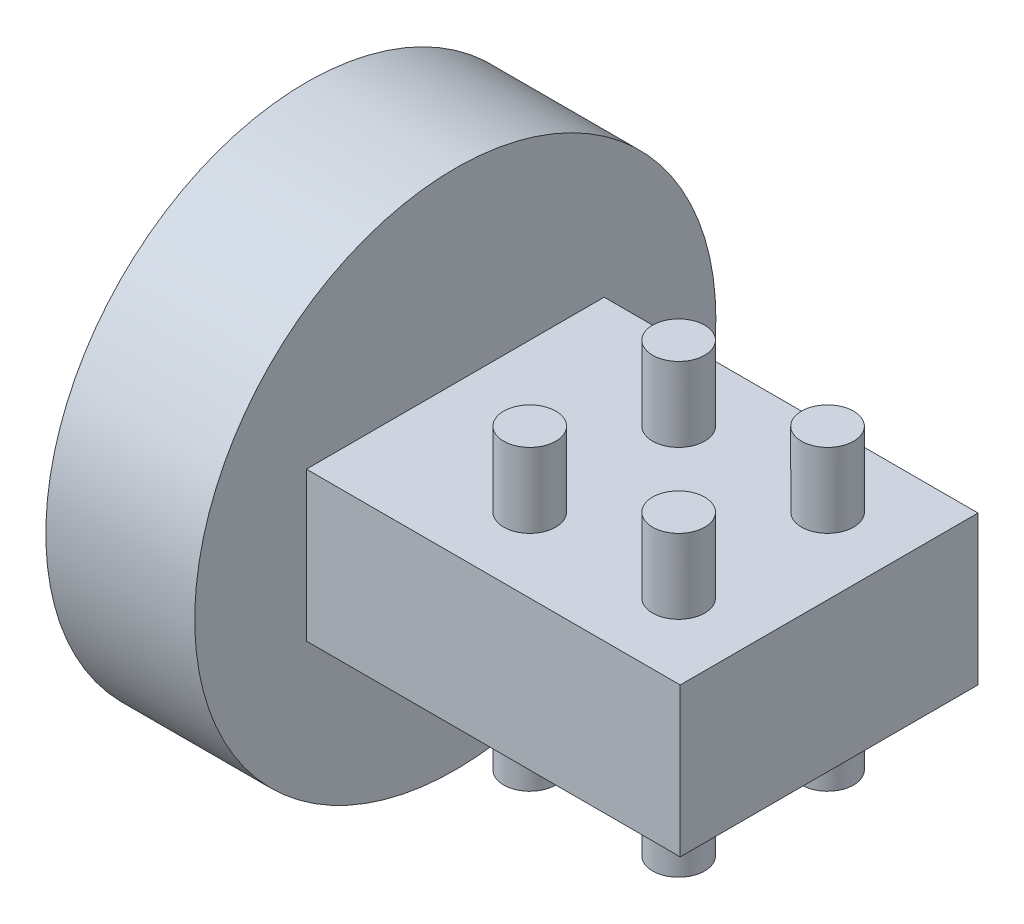
ISO-10303-21;
HEADER;
FILE_DESCRIPTION(('STEP AP214'),'2;1');
FILE_NAME('part.step','',(''),(''),'','','');
FILE_SCHEMA(('AUTOMOTIVE_DESIGN { 1 0 10303 214 1 1 1 1 }'));
ENDSEC;
DATA;
#1=APPLICATION_CONTEXT('core data for automotive mechanical design processes');
#2=APPLICATION_PROTOCOL_DEFINITION('international standard','automotive_design',2000,#1);
#3=PRODUCT_CONTEXT('',#1,'mechanical');
#4=PRODUCT('Part','Part','',(#3));
#5=PRODUCT_RELATED_PRODUCT_CATEGORY('part','',(#4));
#6=PRODUCT_DEFINITION_FORMATION('','',#4);
#7=PRODUCT_DEFINITION_CONTEXT('part definition',#1,'design');
#8=PRODUCT_DEFINITION('design','',#6,#7);
#9=PRODUCT_DEFINITION_SHAPE('','',#8);
#10=(LENGTH_UNIT() NAMED_UNIT(*) SI_UNIT(.MILLI.,.METRE.));
#11=(NAMED_UNIT(*) PLANE_ANGLE_UNIT() SI_UNIT($,.RADIAN.));
#12=(NAMED_UNIT(*) SI_UNIT($,.STERADIAN.) SOLID_ANGLE_UNIT());
#13=UNCERTAINTY_MEASURE_WITH_UNIT(LENGTH_MEASURE(1.E-05),#10,'distance_accuracy_value','');
#14=(GEOMETRIC_REPRESENTATION_CONTEXT(3) GLOBAL_UNCERTAINTY_ASSIGNED_CONTEXT((#13)) GLOBAL_UNIT_ASSIGNED_CONTEXT((#10,
#11,#12)) REPRESENTATION_CONTEXT('',''));
#15=CARTESIAN_POINT('',(0.,0.,0.));
#16=DIRECTION('',(0.,0.,1.));
#17=DIRECTION('',(1.,0.,0.));
#18=AXIS2_PLACEMENT_3D('',#15,#16,#17);
#19=CARTESIAN_POINT('',(20.,0.,0.));
#20=DIRECTION('',(-1.,0.,0.));
#21=DIRECTION('',(0.,0.,1.));
#22=AXIS2_PLACEMENT_3D('',#19,#20,#21);
#23=CYLINDRICAL_SURFACE('',#22,35.);
#24=CARTESIAN_POINT('',(20.,0.,0.));
#25=DIRECTION('',(1.,0.,0.));
#26=DIRECTION('',(0.,0.,-1.));
#27=AXIS2_PLACEMENT_3D('',#24,#25,#26);
#28=CIRCLE('',#27,35.);
#29=CARTESIAN_POINT('',(20.,0.,-35.));
#30=VERTEX_POINT('',#29);
#31=EDGE_CURVE('E124',#30,#30,#28,.T.);
#32=ORIENTED_EDGE('',*,*,#31,.F.);
#33=EDGE_LOOP('',(#32));
#34=FACE_BOUND('',#33,.T.);
#35=CARTESIAN_POINT('',(0.,0.,0.));
#36=DIRECTION('',(1.,0.,0.));
#37=DIRECTION('',(0.,0.,-1.));
#38=AXIS2_PLACEMENT_3D('',#35,#36,#37);
#39=CIRCLE('',#38,35.);
#40=CARTESIAN_POINT('',(0.,0.,-35.));
#41=VERTEX_POINT('',#40);
#42=EDGE_CURVE('E121',#41,#41,#39,.T.);
#43=ORIENTED_EDGE('',*,*,#42,.T.);
#44=EDGE_LOOP('',(#43));
#45=FACE_BOUND('',#44,.T.);
#46=ADVANCED_FACE('F32',(#34,#45),#23,.T.);
#47=CARTESIAN_POINT('',(20.,0.,0.));
#48=DIRECTION('',(1.,0.,0.));
#49=DIRECTION('',(0.,0.,-1.));
#50=AXIS2_PLACEMENT_3D('',#47,#48,#49);
#51=PLANE('',#50);
#52=DIRECTION('',(0.,0.,-1.));
#53=VECTOR('',#52,1.);
#54=CARTESIAN_POINT('',(20.,-10.,0.));
#55=LINE('',#54,#53);
#56=CARTESIAN_POINT('',(20.,-10.,20.));
#57=VERTEX_POINT('',#56);
#58=CARTESIAN_POINT('',(20.,-10.,-20.));
#59=VERTEX_POINT('',#58);
#60=EDGE_CURVE('E56',#57,#59,#55,.T.);
#61=ORIENTED_EDGE('',*,*,#60,.F.);
#62=DIRECTION('',(0.,-1.,0.));
#63=VECTOR('',#62,1.);
#64=CARTESIAN_POINT('',(20.,0.,20.));
#65=LINE('',#64,#63);
#66=CARTESIAN_POINT('',(20.,10.,20.));
#67=VERTEX_POINT('',#66);
#68=EDGE_CURVE('E115',#67,#57,#65,.T.);
#69=ORIENTED_EDGE('',*,*,#68,.F.);
#70=DIRECTION('',(0.,0.,-1.));
#71=VECTOR('',#70,1.);
#72=CARTESIAN_POINT('',(20.,10.,0.));
#73=LINE('',#72,#71);
#74=CARTESIAN_POINT('',(20.,10.,-20.));
#75=VERTEX_POINT('',#74);
#76=EDGE_CURVE('E110',#67,#75,#73,.T.);
#77=ORIENTED_EDGE('',*,*,#76,.T.);
#78=DIRECTION('',(0.,1.,0.));
#79=VECTOR('',#78,1.);
#80=CARTESIAN_POINT('',(20.,0.,-20.));
#81=LINE('',#80,#79);
#82=EDGE_CURVE('E89',#59,#75,#81,.T.);
#83=ORIENTED_EDGE('',*,*,#82,.F.);
#84=EDGE_LOOP('',(#61,#69,#77,#83));
#85=FACE_BOUND('',#84,.T.);
#86=ORIENTED_EDGE('',*,*,#31,.T.);
#87=EDGE_LOOP('',(#86));
#88=FACE_BOUND('',#87,.T.);
#89=ADVANCED_FACE('F178',(#85,#88),#51,.T.);
#90=CARTESIAN_POINT('',(0.,0.,0.));
#91=DIRECTION('',(1.,0.,0.));
#92=DIRECTION('',(0.,0.,-1.));
#93=AXIS2_PLACEMENT_3D('',#90,#91,#92);
#94=PLANE('',#93);
#95=CARTESIAN_POINT('',(0.,0.,0.));
#96=DIRECTION('',(1.,0.,0.));
#97=DIRECTION('',(0.,0.,-1.));
#98=AXIS2_PLACEMENT_3D('',#95,#96,#97);
#99=CIRCLE('',#98,25.);
#100=CARTESIAN_POINT('',(0.,0.,-25.));
#101=VERTEX_POINT('',#100);
#102=EDGE_CURVE('E117',#101,#101,#99,.T.);
#103=ORIENTED_EDGE('',*,*,#102,.T.);
#104=EDGE_LOOP('',(#103));
#105=FACE_BOUND('',#104,.T.);
#106=ORIENTED_EDGE('',*,*,#42,.F.);
#107=EDGE_LOOP('',(#106));
#108=FACE_BOUND('',#107,.T.);
#109=ADVANCED_FACE('F183',(#105,#108),#94,.F.);
#110=CARTESIAN_POINT('',(10.,0.,0.));
#111=DIRECTION('',(-1.,0.,0.));
#112=DIRECTION('',(0.,0.,1.));
#113=AXIS2_PLACEMENT_3D('',#110,#111,#112);
#114=CYLINDRICAL_SURFACE('',#113,25.);
#115=CARTESIAN_POINT('',(10.,0.,0.));
#116=DIRECTION('',(1.,0.,0.));
#117=DIRECTION('',(0.,0.,-1.));
#118=AXIS2_PLACEMENT_3D('',#115,#116,#117);
#119=CIRCLE('',#118,25.);
#120=CARTESIAN_POINT('',(10.,0.,-25.));
#121=VERTEX_POINT('',#120);
#122=EDGE_CURVE('E118',#121,#121,#119,.T.);
#123=ORIENTED_EDGE('',*,*,#122,.T.);
#124=EDGE_LOOP('',(#123));
#125=FACE_BOUND('',#124,.T.);
#126=ORIENTED_EDGE('',*,*,#102,.F.);
#127=EDGE_LOOP('',(#126));
#128=FACE_BOUND('',#127,.T.);
#129=ADVANCED_FACE('F191',(#125,#128),#114,.F.);
#130=CARTESIAN_POINT('',(10.,0.,0.));
#131=DIRECTION('',(1.,0.,0.));
#132=DIRECTION('',(0.,0.,-1.));
#133=AXIS2_PLACEMENT_3D('',#130,#131,#132);
#134=PLANE('',#133);
#135=ORIENTED_EDGE('',*,*,#122,.F.);
#136=EDGE_LOOP('',(#135));
#137=FACE_BOUND('',#136,.T.);
#138=ADVANCED_FACE('F196',(#137),#134,.F.);
#139=CARTESIAN_POINT('',(70.2084526816561,-10.,20.));
#140=DIRECTION('',(1.,0.,0.));
#141=DIRECTION('',(0.,0.,-1.));
#142=AXIS2_PLACEMENT_3D('',#139,#140,#141);
#143=PLANE('',#142);
#144=DIRECTION('',(0.,1.,0.));
#145=VECTOR('',#144,1.);
#146=CARTESIAN_POINT('',(70.2084526816561,-10.,-20.));
#147=LINE('',#146,#145);
#148=CARTESIAN_POINT('',(70.2084526816561,-10.,-20.));
#149=VERTEX_POINT('',#148);
#150=CARTESIAN_POINT('',(70.2084526816561,10.,-20.));
#151=VERTEX_POINT('',#150);
#152=EDGE_CURVE('E77',#149,#151,#147,.T.);
#153=ORIENTED_EDGE('',*,*,#152,.T.);
#154=DIRECTION('',(0.,0.,-1.));
#155=VECTOR('',#154,1.);
#156=CARTESIAN_POINT('',(70.2084526816561,10.,20.));
#157=LINE('',#156,#155);
#158=CARTESIAN_POINT('',(70.2084526816561,10.,20.));
#159=VERTEX_POINT('',#158);
#160=EDGE_CURVE('E80',#159,#151,#157,.T.);
#161=ORIENTED_EDGE('',*,*,#160,.F.);
#162=DIRECTION('',(0.,1.,0.));
#163=VECTOR('',#162,1.);
#164=CARTESIAN_POINT('',(70.2084526816561,-10.,20.));
#165=LINE('',#164,#163);
#166=CARTESIAN_POINT('',(70.2084526816561,-10.,20.));
#167=VERTEX_POINT('',#166);
#168=EDGE_CURVE('E84',#167,#159,#165,.T.);
#169=ORIENTED_EDGE('',*,*,#168,.F.);
#170=DIRECTION('',(0.,0.,-1.));
#171=VECTOR('',#170,1.);
#172=CARTESIAN_POINT('',(70.2084526816561,-10.,20.));
#173=LINE('',#172,#171);
#174=EDGE_CURVE('E82',#167,#149,#173,.T.);
#175=ORIENTED_EDGE('',*,*,#174,.T.);
#176=EDGE_LOOP('',(#153,#161,#169,#175));
#177=FACE_BOUND('',#176,.T.);
#178=ADVANCED_FACE('F78',(#177),#143,.T.);
#179=CARTESIAN_POINT('',(0.208452681656133,-10.,20.));
#180=DIRECTION('',(0.,0.,1.));
#181=DIRECTION('',(1.,0.,0.));
#182=AXIS2_PLACEMENT_3D('',#179,#180,#181);
#183=PLANE('',#182);
#184=DIRECTION('',(1.,0.,0.));
#185=VECTOR('',#184,1.);
#186=CARTESIAN_POINT('',(0.208452681656133,10.,20.));
#187=LINE('',#186,#185);
#188=EDGE_CURVE('E91',#67,#159,#187,.T.);
#189=ORIENTED_EDGE('',*,*,#188,.F.);
#190=ORIENTED_EDGE('',*,*,#68,.T.);
#191=DIRECTION('',(1.,0.,0.));
#192=VECTOR('',#191,1.);
#193=CARTESIAN_POINT('',(0.208452681656133,-10.,20.));
#194=LINE('',#193,#192);
#195=EDGE_CURVE('E85',#57,#167,#194,.T.);
#196=ORIENTED_EDGE('',*,*,#195,.T.);
#197=ORIENTED_EDGE('',*,*,#168,.T.);
#198=EDGE_LOOP('',(#189,#190,#196,#197));
#199=FACE_BOUND('',#198,.T.);
#200=ADVANCED_FACE('F205',(#199),#183,.T.);
#201=CARTESIAN_POINT('',(0.208452681656125,-10.,-20.));
#202=DIRECTION('',(0.,0.,-1.));
#203=DIRECTION('',(-1.,0.,0.));
#204=AXIS2_PLACEMENT_3D('',#201,#202,#203);
#205=PLANE('',#204);
#206=DIRECTION('',(-1.,0.,0.));
#207=VECTOR('',#206,1.);
#208=CARTESIAN_POINT('',(0.208452681656125,-10.,-20.));
#209=LINE('',#208,#207);
#210=EDGE_CURVE('E107',#149,#59,#209,.T.);
#211=ORIENTED_EDGE('',*,*,#210,.T.);
#212=ORIENTED_EDGE('',*,*,#82,.T.);
#213=DIRECTION('',(-1.,0.,0.));
#214=VECTOR('',#213,1.);
#215=CARTESIAN_POINT('',(0.208452681656125,10.,-20.));
#216=LINE('',#215,#214);
#217=EDGE_CURVE('E48',#151,#75,#216,.T.);
#218=ORIENTED_EDGE('',*,*,#217,.F.);
#219=ORIENTED_EDGE('',*,*,#152,.F.);
#220=EDGE_LOOP('',(#211,#212,#218,#219));
#221=FACE_BOUND('',#220,.T.);
#222=ADVANCED_FACE('F87',(#221),#205,.T.);
#223=CARTESIAN_POINT('',(0.,-10.,0.));
#224=DIRECTION('',(0.,-1.,0.));
#225=DIRECTION('',(0.,0.,-1.));
#226=AXIS2_PLACEMENT_3D('',#223,#224,#225);
#227=PLANE('',#226);
#228=CARTESIAN_POINT('',(60.,-10.,10.));
#229=DIRECTION('',(0.,-1.,0.));
#230=DIRECTION('',(0.,0.,-1.));
#231=AXIS2_PLACEMENT_3D('',#228,#229,#230);
#232=CIRCLE('',#231,3.50000000000001);
#233=CARTESIAN_POINT('',(60.,-10.,6.49999999999999));
#234=VERTEX_POINT('',#233);
#235=EDGE_CURVE('E11',#234,#234,#232,.T.);
#236=ORIENTED_EDGE('',*,*,#235,.F.);
#237=EDGE_LOOP('',(#236));
#238=FACE_BOUND('',#237,.T.);
#239=CARTESIAN_POINT('',(60.,-10.,-10.));
#240=DIRECTION('',(0.,-1.,0.));
#241=DIRECTION('',(0.,0.,-1.));
#242=AXIS2_PLACEMENT_3D('',#239,#240,#241);
#243=CIRCLE('',#242,3.50000000000001);
#244=CARTESIAN_POINT('',(60.,-10.,-13.5));
#245=VERTEX_POINT('',#244);
#246=EDGE_CURVE('E40',#245,#245,#243,.T.);
#247=ORIENTED_EDGE('',*,*,#246,.F.);
#248=EDGE_LOOP('',(#247));
#249=FACE_BOUND('',#248,.T.);
#250=CARTESIAN_POINT('',(40.,-10.,-10.));
#251=DIRECTION('',(0.,-1.,0.));
#252=DIRECTION('',(0.,0.,-1.));
#253=AXIS2_PLACEMENT_3D('',#250,#251,#252);
#254=CIRCLE('',#253,3.5);
#255=CARTESIAN_POINT('',(40.,-10.,-13.5));
#256=VERTEX_POINT('',#255);
#257=EDGE_CURVE('E150',#256,#256,#254,.T.);
#258=ORIENTED_EDGE('',*,*,#257,.F.);
#259=EDGE_LOOP('',(#258));
#260=FACE_BOUND('',#259,.T.);
#261=CARTESIAN_POINT('',(40.,-10.,10.));
#262=DIRECTION('',(0.,-1.,0.));
#263=DIRECTION('',(0.,0.,-1.));
#264=AXIS2_PLACEMENT_3D('',#261,#262,#263);
#265=CIRCLE('',#264,3.5);
#266=CARTESIAN_POINT('',(40.,-10.,6.5));
#267=VERTEX_POINT('',#266);
#268=EDGE_CURVE('E102',#267,#267,#265,.T.);
#269=ORIENTED_EDGE('',*,*,#268,.F.);
#270=EDGE_LOOP('',(#269));
#271=FACE_BOUND('',#270,.T.);
#272=ORIENTED_EDGE('',*,*,#195,.F.);
#273=ORIENTED_EDGE('',*,*,#60,.T.);
#274=ORIENTED_EDGE('',*,*,#210,.F.);
#275=ORIENTED_EDGE('',*,*,#174,.F.);
#276=EDGE_LOOP('',(#272,#273,#274,#275));
#277=FACE_BOUND('',#276,.T.);
#278=ADVANCED_FACE('F208',(#238,#249,#260,#271,#277),#227,.T.);
#279=CARTESIAN_POINT('',(0.,10.,0.));
#280=DIRECTION('',(0.,-1.,0.));
#281=DIRECTION('',(0.,0.,-1.));
#282=AXIS2_PLACEMENT_3D('',#279,#280,#281);
#283=PLANE('',#282);
#284=CARTESIAN_POINT('',(60.,10.,10.));
#285=DIRECTION('',(0.,-1.,0.));
#286=DIRECTION('',(0.,0.,-1.));
#287=AXIS2_PLACEMENT_3D('',#284,#285,#286);
#288=CIRCLE('',#287,3.50000000000001);
#289=CARTESIAN_POINT('',(60.,10.,6.49999999999999));
#290=VERTEX_POINT('',#289);
#291=EDGE_CURVE('E35',#290,#290,#288,.T.);
#292=ORIENTED_EDGE('',*,*,#291,.T.);
#293=EDGE_LOOP('',(#292));
#294=FACE_BOUND('',#293,.T.);
#295=CARTESIAN_POINT('',(60.,10.,-10.));
#296=DIRECTION('',(0.,-1.,0.));
#297=DIRECTION('',(0.,0.,-1.));
#298=AXIS2_PLACEMENT_3D('',#295,#296,#297);
#299=CIRCLE('',#298,3.50000000000001);
#300=CARTESIAN_POINT('',(60.,10.,-13.5));
#301=VERTEX_POINT('',#300);
#302=EDGE_CURVE('E133',#301,#301,#299,.T.);
#303=ORIENTED_EDGE('',*,*,#302,.T.);
#304=EDGE_LOOP('',(#303));
#305=FACE_BOUND('',#304,.T.);
#306=CARTESIAN_POINT('',(40.,10.,-10.));
#307=DIRECTION('',(0.,-1.,0.));
#308=DIRECTION('',(0.,0.,-1.));
#309=AXIS2_PLACEMENT_3D('',#306,#307,#308);
#310=CIRCLE('',#309,3.5);
#311=CARTESIAN_POINT('',(40.,10.,-13.5));
#312=VERTEX_POINT('',#311);
#313=EDGE_CURVE('E129',#312,#312,#310,.T.);
#314=ORIENTED_EDGE('',*,*,#313,.T.);
#315=EDGE_LOOP('',(#314));
#316=FACE_BOUND('',#315,.T.);
#317=CARTESIAN_POINT('',(40.,10.,10.));
#318=DIRECTION('',(0.,-1.,0.));
#319=DIRECTION('',(0.,0.,-1.));
#320=AXIS2_PLACEMENT_3D('',#317,#318,#319);
#321=CIRCLE('',#320,3.5);
#322=CARTESIAN_POINT('',(40.,10.,6.5));
#323=VERTEX_POINT('',#322);
#324=EDGE_CURVE('E96',#323,#323,#321,.T.);
#325=ORIENTED_EDGE('',*,*,#324,.T.);
#326=EDGE_LOOP('',(#325));
#327=FACE_BOUND('',#326,.T.);
#328=ORIENTED_EDGE('',*,*,#76,.F.);
#329=ORIENTED_EDGE('',*,*,#188,.T.);
#330=ORIENTED_EDGE('',*,*,#160,.T.);
#331=ORIENTED_EDGE('',*,*,#217,.T.);
#332=EDGE_LOOP('',(#328,#329,#330,#331));
#333=FACE_BOUND('',#332,.T.);
#334=ADVANCED_FACE('F93',(#294,#305,#316,#327,#333),#283,.F.);
#335=CARTESIAN_POINT('',(40.,20.,10.));
#336=DIRECTION('',(0.,1.,0.));
#337=DIRECTION('',(0.,0.,1.));
#338=AXIS2_PLACEMENT_3D('',#335,#336,#337);
#339=PLANE('',#338);
#340=CARTESIAN_POINT('',(40.,20.,10.));
#341=DIRECTION('',(0.,1.,0.));
#342=DIRECTION('',(0.,0.,1.));
#343=AXIS2_PLACEMENT_3D('',#340,#341,#342);
#344=CIRCLE('',#343,3.5);
#345=CARTESIAN_POINT('',(40.,20.,13.5));
#346=VERTEX_POINT('',#345);
#347=EDGE_CURVE('E131',#346,#346,#344,.T.);
#348=ORIENTED_EDGE('',*,*,#347,.T.);
#349=EDGE_LOOP('',(#348));
#350=FACE_BOUND('',#349,.T.);
#351=ADVANCED_FACE('F216',(#350),#339,.T.);
#352=CARTESIAN_POINT('',(40.,-20.,10.));
#353=DIRECTION('',(0.,1.,0.));
#354=DIRECTION('',(0.,0.,1.));
#355=AXIS2_PLACEMENT_3D('',#352,#353,#354);
#356=CYLINDRICAL_SURFACE('',#355,3.5);
#357=ORIENTED_EDGE('',*,*,#347,.F.);
#358=EDGE_LOOP('',(#357));
#359=FACE_BOUND('',#358,.T.);
#360=ORIENTED_EDGE('',*,*,#324,.F.);
#361=EDGE_LOOP('',(#360));
#362=FACE_BOUND('',#361,.T.);
#363=ADVANCED_FACE('F173',(#359,#362),#356,.T.);
#364=ORIENTED_EDGE('',*,*,#268,.T.);
#365=EDGE_LOOP('',(#364));
#366=FACE_BOUND('',#365,.T.);
#367=CARTESIAN_POINT('',(40.,-20.,10.));
#368=DIRECTION('',(0.,1.,0.));
#369=DIRECTION('',(0.,0.,1.));
#370=AXIS2_PLACEMENT_3D('',#367,#368,#369);
#371=CIRCLE('',#370,3.5);
#372=CARTESIAN_POINT('',(40.,-20.,13.5));
#373=VERTEX_POINT('',#372);
#374=EDGE_CURVE('E99',#373,#373,#371,.T.);
#375=ORIENTED_EDGE('',*,*,#374,.T.);
#376=EDGE_LOOP('',(#375));
#377=FACE_BOUND('',#376,.T.);
#378=ADVANCED_FACE('F160',(#366,#377),#356,.T.);
#379=CARTESIAN_POINT('',(40.,-20.,10.));
#380=DIRECTION('',(0.,1.,0.));
#381=DIRECTION('',(0.,0.,1.));
#382=AXIS2_PLACEMENT_3D('',#379,#380,#381);
#383=PLANE('',#382);
#384=ORIENTED_EDGE('',*,*,#374,.F.);
#385=EDGE_LOOP('',(#384));
#386=FACE_BOUND('',#385,.T.);
#387=ADVANCED_FACE('F162',(#386),#383,.F.);
#388=CARTESIAN_POINT('',(40.,20.,-10.));
#389=DIRECTION('',(0.,1.,0.));
#390=DIRECTION('',(0.,0.,1.));
#391=AXIS2_PLACEMENT_3D('',#388,#389,#390);
#392=PLANE('',#391);
#393=CARTESIAN_POINT('',(40.,20.,-10.));
#394=DIRECTION('',(0.,1.,0.));
#395=DIRECTION('',(0.,0.,1.));
#396=AXIS2_PLACEMENT_3D('',#393,#394,#395);
#397=CIRCLE('',#396,3.5);
#398=CARTESIAN_POINT('',(40.,20.,-6.5));
#399=VERTEX_POINT('',#398);
#400=EDGE_CURVE('E135',#399,#399,#397,.T.);
#401=ORIENTED_EDGE('',*,*,#400,.T.);
#402=EDGE_LOOP('',(#401));
#403=FACE_BOUND('',#402,.T.);
#404=ADVANCED_FACE('F164',(#403),#392,.T.);
#405=CARTESIAN_POINT('',(40.,-20.,-10.));
#406=DIRECTION('',(0.,1.,0.));
#407=DIRECTION('',(0.,0.,1.));
#408=AXIS2_PLACEMENT_3D('',#405,#406,#407);
#409=CYLINDRICAL_SURFACE('',#408,3.5);
#410=ORIENTED_EDGE('',*,*,#400,.F.);
#411=EDGE_LOOP('',(#410));
#412=FACE_BOUND('',#411,.T.);
#413=ORIENTED_EDGE('',*,*,#313,.F.);
#414=EDGE_LOOP('',(#413));
#415=FACE_BOUND('',#414,.T.);
#416=ADVANCED_FACE('F170',(#412,#415),#409,.T.);
#417=ORIENTED_EDGE('',*,*,#257,.T.);
#418=EDGE_LOOP('',(#417));
#419=FACE_BOUND('',#418,.T.);
#420=CARTESIAN_POINT('',(40.,-20.,-10.));
#421=DIRECTION('',(0.,1.,0.));
#422=DIRECTION('',(0.,0.,1.));
#423=AXIS2_PLACEMENT_3D('',#420,#421,#422);
#424=CIRCLE('',#423,3.5);
#425=CARTESIAN_POINT('',(40.,-20.,-6.5));
#426=VERTEX_POINT('',#425);
#427=EDGE_CURVE('E132',#426,#426,#424,.T.);
#428=ORIENTED_EDGE('',*,*,#427,.T.);
#429=EDGE_LOOP('',(#428));
#430=FACE_BOUND('',#429,.T.);
#431=ADVANCED_FACE('F259',(#419,#430),#409,.T.);
#432=CARTESIAN_POINT('',(40.,-20.,-10.));
#433=DIRECTION('',(0.,1.,0.));
#434=DIRECTION('',(0.,0.,1.));
#435=AXIS2_PLACEMENT_3D('',#432,#433,#434);
#436=PLANE('',#435);
#437=ORIENTED_EDGE('',*,*,#427,.F.);
#438=EDGE_LOOP('',(#437));
#439=FACE_BOUND('',#438,.T.);
#440=ADVANCED_FACE('F269',(#439),#436,.F.);
#441=CARTESIAN_POINT('',(60.,20.,-10.));
#442=DIRECTION('',(0.,1.,0.));
#443=DIRECTION('',(0.,0.,1.));
#444=AXIS2_PLACEMENT_3D('',#441,#442,#443);
#445=PLANE('',#444);
#446=CARTESIAN_POINT('',(60.,20.,-10.));
#447=DIRECTION('',(0.,1.,0.));
#448=DIRECTION('',(0.,0.,1.));
#449=AXIS2_PLACEMENT_3D('',#446,#447,#448);
#450=CIRCLE('',#449,3.50000000000001);
#451=CARTESIAN_POINT('',(60.,20.,-6.49999999999999));
#452=VERTEX_POINT('',#451);
#453=EDGE_CURVE('E142',#452,#452,#450,.T.);
#454=ORIENTED_EDGE('',*,*,#453,.T.);
#455=EDGE_LOOP('',(#454));
#456=FACE_BOUND('',#455,.T.);
#457=ADVANCED_FACE('F278',(#456),#445,.T.);
#458=CARTESIAN_POINT('',(60.,-20.,-10.));
#459=DIRECTION('',(0.,1.,0.));
#460=DIRECTION('',(0.,0.,1.));
#461=AXIS2_PLACEMENT_3D('',#458,#459,#460);
#462=CYLINDRICAL_SURFACE('',#461,3.50000000000001);
#463=ORIENTED_EDGE('',*,*,#453,.F.);
#464=EDGE_LOOP('',(#463));
#465=FACE_BOUND('',#464,.T.);
#466=ORIENTED_EDGE('',*,*,#302,.F.);
#467=EDGE_LOOP('',(#466));
#468=FACE_BOUND('',#467,.T.);
#469=ADVANCED_FACE('F288',(#465,#468),#462,.T.);
#470=ORIENTED_EDGE('',*,*,#246,.T.);
#471=EDGE_LOOP('',(#470));
#472=FACE_BOUND('',#471,.T.);
#473=CARTESIAN_POINT('',(60.,-20.,-10.));
#474=DIRECTION('',(0.,1.,0.));
#475=DIRECTION('',(0.,0.,1.));
#476=AXIS2_PLACEMENT_3D('',#473,#474,#475);
#477=CIRCLE('',#476,3.50000000000001);
#478=CARTESIAN_POINT('',(60.,-20.,-6.49999999999999));
#479=VERTEX_POINT('',#478);
#480=EDGE_CURVE('E136',#479,#479,#477,.T.);
#481=ORIENTED_EDGE('',*,*,#480,.T.);
#482=EDGE_LOOP('',(#481));
#483=FACE_BOUND('',#482,.T.);
#484=ADVANCED_FACE('F298',(#472,#483),#462,.T.);
#485=CARTESIAN_POINT('',(60.,-20.,-10.));
#486=DIRECTION('',(0.,1.,0.));
#487=DIRECTION('',(0.,0.,1.));
#488=AXIS2_PLACEMENT_3D('',#485,#486,#487);
#489=PLANE('',#488);
#490=ORIENTED_EDGE('',*,*,#480,.F.);
#491=EDGE_LOOP('',(#490));
#492=FACE_BOUND('',#491,.T.);
#493=ADVANCED_FACE('F308',(#492),#489,.F.);
#494=CARTESIAN_POINT('',(60.,20.,10.));
#495=DIRECTION('',(0.,1.,0.));
#496=DIRECTION('',(0.,0.,1.));
#497=AXIS2_PLACEMENT_3D('',#494,#495,#496);
#498=PLANE('',#497);
#499=CARTESIAN_POINT('',(60.,20.,10.));
#500=DIRECTION('',(0.,1.,0.));
#501=DIRECTION('',(0.,0.,1.));
#502=AXIS2_PLACEMENT_3D('',#499,#500,#501);
#503=CIRCLE('',#502,3.50000000000001);
#504=CARTESIAN_POINT('',(60.,20.,13.5));
#505=VERTEX_POINT('',#504);
#506=EDGE_CURVE('E427',#505,#505,#503,.T.);
#507=ORIENTED_EDGE('',*,*,#506,.T.);
#508=EDGE_LOOP('',(#507));
#509=FACE_BOUND('',#508,.T.);
#510=ADVANCED_FACE('F317',(#509),#498,.T.);
#511=CARTESIAN_POINT('',(60.,-20.,10.));
#512=DIRECTION('',(0.,1.,0.));
#513=DIRECTION('',(0.,0.,1.));
#514=AXIS2_PLACEMENT_3D('',#511,#512,#513);
#515=CYLINDRICAL_SURFACE('',#514,3.50000000000001);
#516=ORIENTED_EDGE('',*,*,#506,.F.);
#517=EDGE_LOOP('',(#516));
#518=FACE_BOUND('',#517,.T.);
#519=ORIENTED_EDGE('',*,*,#291,.F.);
#520=EDGE_LOOP('',(#519));
#521=FACE_BOUND('',#520,.T.);
#522=ADVANCED_FACE('F327',(#518,#521),#515,.T.);
#523=ORIENTED_EDGE('',*,*,#235,.T.);
#524=EDGE_LOOP('',(#523));
#525=FACE_BOUND('',#524,.T.);
#526=CARTESIAN_POINT('',(60.,-20.,10.));
#527=DIRECTION('',(0.,1.,0.));
#528=DIRECTION('',(0.,0.,1.));
#529=AXIS2_PLACEMENT_3D('',#526,#527,#528);
#530=CIRCLE('',#529,3.50000000000001);
#531=CARTESIAN_POINT('',(60.,-20.,13.5));
#532=VERTEX_POINT('',#531);
#533=EDGE_CURVE('E425',#532,#532,#530,.T.);
#534=ORIENTED_EDGE('',*,*,#533,.T.);
#535=EDGE_LOOP('',(#534));
#536=FACE_BOUND('',#535,.T.);
#537=ADVANCED_FACE('F337',(#525,#536),#515,.T.);
#538=CARTESIAN_POINT('',(60.,-20.,10.));
#539=DIRECTION('',(0.,1.,0.));
#540=DIRECTION('',(0.,0.,1.));
#541=AXIS2_PLACEMENT_3D('',#538,#539,#540);
#542=PLANE('',#541);
#543=ORIENTED_EDGE('',*,*,#533,.F.);
#544=EDGE_LOOP('',(#543));
#545=FACE_BOUND('',#544,.T.);
#546=ADVANCED_FACE('F347',(#545),#542,.F.);
#547=CLOSED_SHELL('',(#46,#89,#109,#129,#138,#178,#200,#222,#278,#334,#351,#363,#378,#387,#404,
#416,#431,#440,#457,#469,#484,#493,#510,#522,#537,#546));
#548=MANIFOLD_SOLID_BREP('B2',#547);
#549=ADVANCED_BREP_SHAPE_REPRESENTATION('',(#18,#548),#14);
#550=SHAPE_DEFINITION_REPRESENTATION(#9,#549);
ENDSEC;
END-ISO-10303-21;
